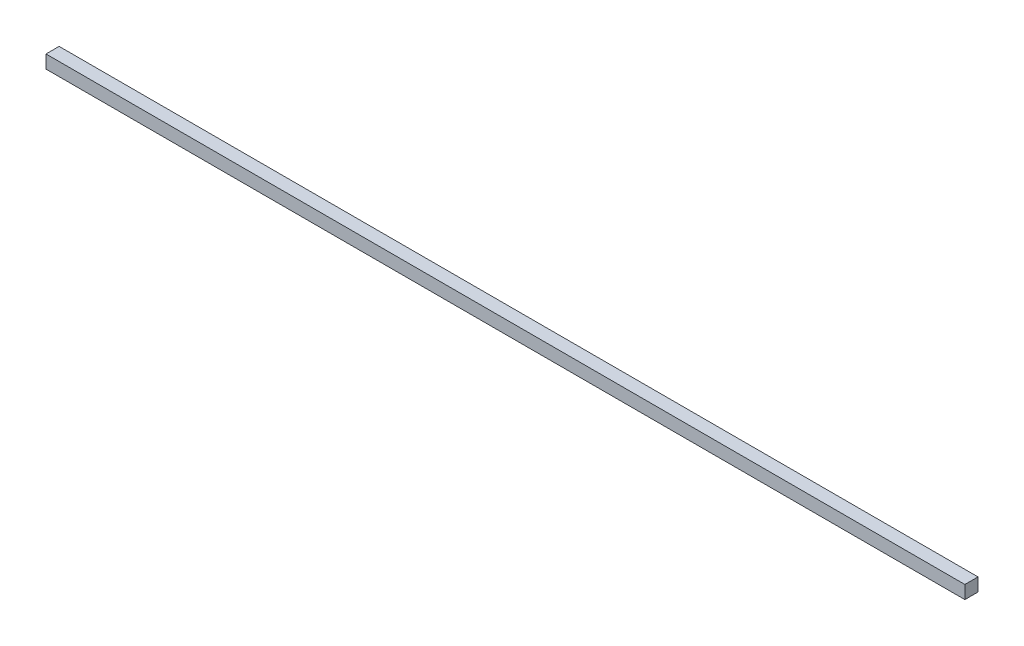
ISO-10303-21;
HEADER;
FILE_DESCRIPTION(('STEP AP214'),'2;1');
FILE_NAME('part.step','',(''),(''),'','','');
FILE_SCHEMA(('AUTOMOTIVE_DESIGN { 1 0 10303 214 1 1 1 1 }'));
ENDSEC;
DATA;
#1=APPLICATION_CONTEXT('core data for automotive mechanical design processes');
#2=APPLICATION_PROTOCOL_DEFINITION('international standard','automotive_design',2000,#1);
#3=PRODUCT_CONTEXT('',#1,'mechanical');
#4=PRODUCT('Part','Part','',(#3));
#5=PRODUCT_RELATED_PRODUCT_CATEGORY('part','',(#4));
#6=PRODUCT_DEFINITION_FORMATION('','',#4);
#7=PRODUCT_DEFINITION_CONTEXT('part definition',#1,'design');
#8=PRODUCT_DEFINITION('design','',#6,#7);
#9=PRODUCT_DEFINITION_SHAPE('','',#8);
#10=(LENGTH_UNIT() NAMED_UNIT(*) SI_UNIT(.MILLI.,.METRE.));
#11=(NAMED_UNIT(*) PLANE_ANGLE_UNIT() SI_UNIT($,.RADIAN.));
#12=(NAMED_UNIT(*) SI_UNIT($,.STERADIAN.) SOLID_ANGLE_UNIT());
#13=UNCERTAINTY_MEASURE_WITH_UNIT(LENGTH_MEASURE(1.E-05),#10,'distance_accuracy_value','');
#14=(GEOMETRIC_REPRESENTATION_CONTEXT(3) GLOBAL_UNCERTAINTY_ASSIGNED_CONTEXT((#13)) GLOBAL_UNIT_ASSIGNED_CONTEXT((#10,
#11,#12)) REPRESENTATION_CONTEXT('',''));
#15=CARTESIAN_POINT('',(0.,0.,0.));
#16=DIRECTION('',(0.,0.,1.));
#17=DIRECTION('',(1.,0.,0.));
#18=AXIS2_PLACEMENT_3D('',#15,#16,#17);
#19=CARTESIAN_POINT('',(-190.699524940618,-68.2375296912113,6.));
#20=DIRECTION('',(0.,1.,0.));
#21=DIRECTION('',(-1.,0.,0.));
#22=AXIS2_PLACEMENT_3D('',#19,#20,#21);
#23=PLANE('',#22);
#24=DIRECTION('',(1.,0.,0.));
#25=VECTOR('',#24,1.);
#26=CARTESIAN_POINT('',(-190.699524940618,-68.2375296912113,0.));
#27=LINE('',#26,#25);
#28=CARTESIAN_POINT('',(-190.699524940618,-68.2375296912113,0.));
#29=VERTEX_POINT('',#28);
#30=CARTESIAN_POINT('',(229.300475059382,-68.2375296912113,0.));
#31=VERTEX_POINT('',#30);
#32=EDGE_CURVE('E104',#29,#31,#27,.T.);
#33=ORIENTED_EDGE('',*,*,#32,.T.);
#34=DIRECTION('',(0.,0.,-1.));
#35=VECTOR('',#34,1.);
#36=CARTESIAN_POINT('',(229.300475059382,-68.2375296912113,6.));
#37=LINE('',#36,#35);
#38=CARTESIAN_POINT('',(229.300475059382,-68.2375296912113,6.));
#39=VERTEX_POINT('',#38);
#40=EDGE_CURVE('E11',#39,#31,#37,.T.);
#41=ORIENTED_EDGE('',*,*,#40,.F.);
#42=DIRECTION('',(1.,0.,0.));
#43=VECTOR('',#42,1.);
#44=CARTESIAN_POINT('',(-190.699524940618,-68.2375296912113,6.));
#45=LINE('',#44,#43);
#46=CARTESIAN_POINT('',(-190.699524940618,-68.2375296912113,6.));
#47=VERTEX_POINT('',#46);
#48=EDGE_CURVE('E92',#47,#39,#45,.T.);
#49=ORIENTED_EDGE('',*,*,#48,.F.);
#50=DIRECTION('',(0.,0.,-1.));
#51=VECTOR('',#50,1.);
#52=CARTESIAN_POINT('',(-190.699524940618,-68.2375296912113,6.));
#53=LINE('',#52,#51);
#54=EDGE_CURVE('E100',#47,#29,#53,.T.);
#55=ORIENTED_EDGE('',*,*,#54,.T.);
#56=EDGE_LOOP('',(#33,#41,#49,#55));
#57=FACE_BOUND('',#56,.T.);
#58=ADVANCED_FACE('F41',(#57),#23,.F.);
#59=CARTESIAN_POINT('',(229.300475059382,-68.2375296912113,6.));
#60=DIRECTION('',(-1.,0.,0.));
#61=DIRECTION('',(0.,0.,1.));
#62=AXIS2_PLACEMENT_3D('',#59,#60,#61);
#63=PLANE('',#62);
#64=DIRECTION('',(0.,1.,0.));
#65=VECTOR('',#64,1.);
#66=CARTESIAN_POINT('',(229.300475059382,-68.2375296912113,0.));
#67=LINE('',#66,#65);
#68=CARTESIAN_POINT('',(229.300475059382,-62.2375296912113,0.));
#69=VERTEX_POINT('',#68);
#70=EDGE_CURVE('E96',#31,#69,#67,.T.);
#71=ORIENTED_EDGE('',*,*,#70,.T.);
#72=DIRECTION('',(0.,0.,-1.));
#73=VECTOR('',#72,1.);
#74=CARTESIAN_POINT('',(229.300475059382,-62.2375296912113,6.));
#75=LINE('',#74,#73);
#76=CARTESIAN_POINT('',(229.300475059382,-62.2375296912113,6.));
#77=VERTEX_POINT('',#76);
#78=EDGE_CURVE('E49',#77,#69,#75,.T.);
#79=ORIENTED_EDGE('',*,*,#78,.F.);
#80=DIRECTION('',(0.,1.,0.));
#81=VECTOR('',#80,1.);
#82=CARTESIAN_POINT('',(229.300475059382,-68.2375296912113,6.));
#83=LINE('',#82,#81);
#84=EDGE_CURVE('E87',#39,#77,#83,.T.);
#85=ORIENTED_EDGE('',*,*,#84,.F.);
#86=ORIENTED_EDGE('',*,*,#40,.T.);
#87=EDGE_LOOP('',(#71,#79,#85,#86));
#88=FACE_BOUND('',#87,.T.);
#89=ADVANCED_FACE('F95',(#88),#63,.F.);
#90=CARTESIAN_POINT('',(-190.699524940618,-62.2375296912113,6.));
#91=DIRECTION('',(0.,-1.,0.));
#92=DIRECTION('',(1.,0.,0.));
#93=AXIS2_PLACEMENT_3D('',#90,#91,#92);
#94=PLANE('',#93);
#95=DIRECTION('',(-1.,0.,0.));
#96=VECTOR('',#95,1.);
#97=CARTESIAN_POINT('',(-190.699524940618,-62.2375296912113,0.));
#98=LINE('',#97,#96);
#99=CARTESIAN_POINT('',(-190.699524940618,-62.2375296912113,0.));
#100=VERTEX_POINT('',#99);
#101=EDGE_CURVE('E74',#69,#100,#98,.T.);
#102=ORIENTED_EDGE('',*,*,#101,.T.);
#103=DIRECTION('',(0.,0.,-1.));
#104=VECTOR('',#103,1.);
#105=CARTESIAN_POINT('',(-190.699524940618,-62.2375296912113,6.));
#106=LINE('',#105,#104);
#107=CARTESIAN_POINT('',(-190.699524940618,-62.2375296912113,6.));
#108=VERTEX_POINT('',#107);
#109=EDGE_CURVE('E97',#108,#100,#106,.T.);
#110=ORIENTED_EDGE('',*,*,#109,.F.);
#111=DIRECTION('',(-1.,0.,0.));
#112=VECTOR('',#111,1.);
#113=CARTESIAN_POINT('',(-190.699524940618,-62.2375296912113,6.));
#114=LINE('',#113,#112);
#115=EDGE_CURVE('E90',#77,#108,#114,.T.);
#116=ORIENTED_EDGE('',*,*,#115,.F.);
#117=ORIENTED_EDGE('',*,*,#78,.T.);
#118=EDGE_LOOP('',(#102,#110,#116,#117));
#119=FACE_BOUND('',#118,.T.);
#120=ADVANCED_FACE('F98',(#119),#94,.F.);
#121=CARTESIAN_POINT('',(-190.699524940618,-68.2375296912113,6.));
#122=DIRECTION('',(1.,0.,0.));
#123=DIRECTION('',(0.,0.,-1.));
#124=AXIS2_PLACEMENT_3D('',#121,#122,#123);
#125=PLANE('',#124);
#126=DIRECTION('',(0.,-1.,0.));
#127=VECTOR('',#126,1.);
#128=CARTESIAN_POINT('',(-190.699524940618,-68.2375296912113,0.));
#129=LINE('',#128,#127);
#130=EDGE_CURVE('E80',#100,#29,#129,.T.);
#131=ORIENTED_EDGE('',*,*,#130,.T.);
#132=ORIENTED_EDGE('',*,*,#54,.F.);
#133=DIRECTION('',(0.,-1.,0.));
#134=VECTOR('',#133,1.);
#135=CARTESIAN_POINT('',(-190.699524940618,-68.2375296912113,6.));
#136=LINE('',#135,#134);
#137=EDGE_CURVE('E57',#108,#47,#136,.T.);
#138=ORIENTED_EDGE('',*,*,#137,.F.);
#139=ORIENTED_EDGE('',*,*,#109,.T.);
#140=EDGE_LOOP('',(#131,#132,#138,#139));
#141=FACE_BOUND('',#140,.T.);
#142=ADVANCED_FACE('F111',(#141),#125,.F.);
#143=CARTESIAN_POINT('',(0.,0.,6.));
#144=DIRECTION('',(0.,0.,1.));
#145=DIRECTION('',(1.,0.,0.));
#146=AXIS2_PLACEMENT_3D('',#143,#144,#145);
#147=PLANE('',#146);
#148=ORIENTED_EDGE('',*,*,#48,.T.);
#149=ORIENTED_EDGE('',*,*,#84,.T.);
#150=ORIENTED_EDGE('',*,*,#115,.T.);
#151=ORIENTED_EDGE('',*,*,#137,.T.);
#152=EDGE_LOOP('',(#148,#149,#150,#151));
#153=FACE_BOUND('',#152,.T.);
#154=ADVANCED_FACE('F88',(#153),#147,.T.);
#155=CARTESIAN_POINT('',(0.,0.,0.));
#156=DIRECTION('',(0.,0.,1.));
#157=DIRECTION('',(1.,0.,0.));
#158=AXIS2_PLACEMENT_3D('',#155,#156,#157);
#159=PLANE('',#158);
#160=ORIENTED_EDGE('',*,*,#32,.F.);
#161=ORIENTED_EDGE('',*,*,#130,.F.);
#162=ORIENTED_EDGE('',*,*,#101,.F.);
#163=ORIENTED_EDGE('',*,*,#70,.F.);
#164=EDGE_LOOP('',(#160,#161,#162,#163));
#165=FACE_BOUND('',#164,.T.);
#166=ADVANCED_FACE('F114',(#165),#159,.F.);
#167=CLOSED_SHELL('',(#58,#89,#120,#142,#154,#166));
#168=MANIFOLD_SOLID_BREP('B2',#167);
#169=ADVANCED_BREP_SHAPE_REPRESENTATION('',(#18,#168),#14);
#170=SHAPE_DEFINITION_REPRESENTATION(#9,#169);
ENDSEC;
END-ISO-10303-21;
